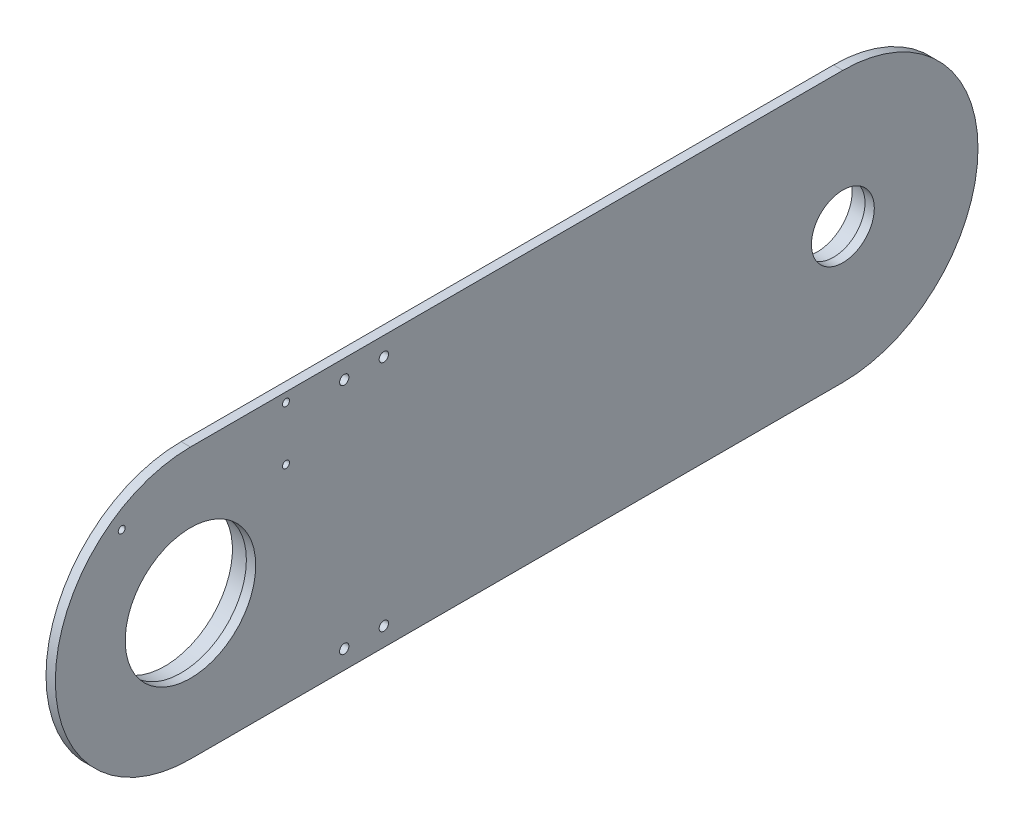
ISO-10303-21;
HEADER;
FILE_DESCRIPTION(('STEP AP214'),'2;1');
FILE_NAME('part.step','',(''),(''),'','','');
FILE_SCHEMA(('AUTOMOTIVE_DESIGN { 1 0 10303 214 1 1 1 1 }'));
ENDSEC;
DATA;
#1=APPLICATION_CONTEXT('core data for automotive mechanical design processes');
#2=APPLICATION_PROTOCOL_DEFINITION('international standard','automotive_design',2000,#1);
#3=PRODUCT_CONTEXT('',#1,'mechanical');
#4=PRODUCT('Part','Part','',(#3));
#5=PRODUCT_RELATED_PRODUCT_CATEGORY('part','',(#4));
#6=PRODUCT_DEFINITION_FORMATION('','',#4);
#7=PRODUCT_DEFINITION_CONTEXT('part definition',#1,'design');
#8=PRODUCT_DEFINITION('design','',#6,#7);
#9=PRODUCT_DEFINITION_SHAPE('','',#8);
#10=(LENGTH_UNIT() NAMED_UNIT(*) SI_UNIT(.MILLI.,.METRE.));
#11=(NAMED_UNIT(*) PLANE_ANGLE_UNIT() SI_UNIT($,.RADIAN.));
#12=(NAMED_UNIT(*) SI_UNIT($,.STERADIAN.) SOLID_ANGLE_UNIT());
#13=UNCERTAINTY_MEASURE_WITH_UNIT(LENGTH_MEASURE(1.E-05),#10,'distance_accuracy_value','');
#14=(GEOMETRIC_REPRESENTATION_CONTEXT(3) GLOBAL_UNCERTAINTY_ASSIGNED_CONTEXT((#13)) GLOBAL_UNIT_ASSIGNED_CONTEXT((#10,
#11,#12)) REPRESENTATION_CONTEXT('',''));
#15=CARTESIAN_POINT('',(0.,0.,0.));
#16=DIRECTION('',(0.,0.,1.));
#17=DIRECTION('',(1.,0.,0.));
#18=AXIS2_PLACEMENT_3D('',#15,#16,#17);
#19=CARTESIAN_POINT('',(4.,0.,0.));
#20=DIRECTION('',(1.,0.,0.));
#21=DIRECTION('',(0.,0.,-1.));
#22=AXIS2_PLACEMENT_3D('',#19,#20,#21);
#23=PLANE('',#22);
#24=CARTESIAN_POINT('',(4.,42.,29.5));
#25=DIRECTION('',(1.,0.,0.));
#26=DIRECTION('',(0.,0.,-1.));
#27=AXIS2_PLACEMENT_3D('',#24,#25,#26);
#28=CIRCLE('',#27,1.5);
#29=CARTESIAN_POINT('',(4.,42.,28.));
#30=VERTEX_POINT('',#29);
#31=EDGE_CURVE('E162',#30,#30,#28,.T.);
#32=ORIENTED_EDGE('',*,*,#31,.F.);
#33=EDGE_LOOP('',(#32));
#34=FACE_BOUND('',#33,.T.);
#35=CARTESIAN_POINT('',(4.,54.,-41.));
#36=DIRECTION('',(1.,0.,0.));
#37=DIRECTION('',(0.,0.,-1.));
#38=AXIS2_PLACEMENT_3D('',#35,#36,#37);
#39=CIRCLE('',#38,1.5);
#40=CARTESIAN_POINT('',(4.,54.,-42.5));
#41=VERTEX_POINT('',#40);
#42=EDGE_CURVE('E514',#41,#41,#39,.T.);
#43=ORIENTED_EDGE('',*,*,#42,.F.);
#44=EDGE_LOOP('',(#43));
#45=FACE_BOUND('',#44,.T.);
#46=CARTESIAN_POINT('',(4.,31.,-41.));
#47=DIRECTION('',(1.,0.,0.));
#48=DIRECTION('',(0.,0.,-1.));
#49=AXIS2_PLACEMENT_3D('',#46,#47,#48);
#50=CIRCLE('',#49,1.5);
#51=CARTESIAN_POINT('',(4.,31.,-42.5));
#52=VERTEX_POINT('',#51);
#53=EDGE_CURVE('E508',#52,#52,#50,.T.);
#54=ORIENTED_EDGE('',*,*,#53,.F.);
#55=EDGE_LOOP('',(#54));
#56=FACE_BOUND('',#55,.T.);
#57=CARTESIAN_POINT('',(4.,50.,-83.));
#58=DIRECTION('',(1.,0.,0.));
#59=DIRECTION('',(0.,0.,-1.));
#60=AXIS2_PLACEMENT_3D('',#57,#58,#59);
#61=CIRCLE('',#60,2.);
#62=CARTESIAN_POINT('',(4.,50.,-85.));
#63=VERTEX_POINT('',#62);
#64=EDGE_CURVE('E180',#63,#63,#61,.T.);
#65=ORIENTED_EDGE('',*,*,#64,.F.);
#66=EDGE_LOOP('',(#65));
#67=FACE_BOUND('',#66,.T.);
#68=CARTESIAN_POINT('',(4.,-50.,-83.));
#69=DIRECTION('',(-1.,0.,0.));
#70=DIRECTION('',(0.,0.,1.));
#71=AXIS2_PLACEMENT_3D('',#68,#69,#70);
#72=CIRCLE('',#71,2.);
#73=CARTESIAN_POINT('',(4.,-50.,-81.));
#74=VERTEX_POINT('',#73);
#75=EDGE_CURVE('E169',#74,#74,#72,.T.);
#76=ORIENTED_EDGE('',*,*,#75,.T.);
#77=EDGE_LOOP('',(#76));
#78=FACE_BOUND('',#77,.T.);
#79=CARTESIAN_POINT('',(4.,50.,-66.));
#80=DIRECTION('',(-1.,0.,0.));
#81=DIRECTION('',(0.,0.,1.));
#82=AXIS2_PLACEMENT_3D('',#79,#80,#81);
#83=CIRCLE('',#82,2.);
#84=CARTESIAN_POINT('',(4.,50.,-64.));
#85=VERTEX_POINT('',#84);
#86=EDGE_CURVE('E200',#85,#85,#83,.T.);
#87=ORIENTED_EDGE('',*,*,#86,.T.);
#88=EDGE_LOOP('',(#87));
#89=FACE_BOUND('',#88,.T.);
#90=CARTESIAN_POINT('',(4.,0.,0.));
#91=DIRECTION('',(1.,0.,0.));
#92=DIRECTION('',(0.,0.,-1.));
#93=AXIS2_PLACEMENT_3D('',#90,#91,#92);
#94=CIRCLE('',#93,28.);
#95=CARTESIAN_POINT('',(4.,0.,-28.));
#96=VERTEX_POINT('',#95);
#97=EDGE_CURVE('E126',#96,#96,#94,.T.);
#98=ORIENTED_EDGE('',*,*,#97,.F.);
#99=EDGE_LOOP('',(#98));
#100=FACE_BOUND('',#99,.T.);
#101=CARTESIAN_POINT('',(4.,0.,0.));
#102=DIRECTION('',(1.,0.,0.));
#103=DIRECTION('',(0.,0.,-1.));
#104=AXIS2_PLACEMENT_3D('',#101,#102,#103);
#105=CIRCLE('',#104,58.);
#106=CARTESIAN_POINT('',(4.,58.,0.));
#107=VERTEX_POINT('',#106);
#108=CARTESIAN_POINT('',(4.,-58.,0.));
#109=VERTEX_POINT('',#108);
#110=EDGE_CURVE('E103',#107,#109,#105,.T.);
#111=ORIENTED_EDGE('',*,*,#110,.T.);
#112=DIRECTION('',(0.,0.,-1.));
#113=VECTOR('',#112,1.);
#114=CARTESIAN_POINT('',(4.,-58.,0.));
#115=LINE('',#114,#113);
#116=CARTESIAN_POINT('',(4.,-58.,-280.));
#117=VERTEX_POINT('',#116);
#118=EDGE_CURVE('E98',#109,#117,#115,.T.);
#119=ORIENTED_EDGE('',*,*,#118,.T.);
#120=CARTESIAN_POINT('',(4.,0.,-280.));
#121=DIRECTION('',(1.,0.,0.));
#122=DIRECTION('',(0.,0.,-1.));
#123=AXIS2_PLACEMENT_3D('',#120,#121,#122);
#124=CIRCLE('',#123,58.);
#125=CARTESIAN_POINT('',(4.,58.,-280.));
#126=VERTEX_POINT('',#125);
#127=EDGE_CURVE('E101',#117,#126,#124,.T.);
#128=ORIENTED_EDGE('',*,*,#127,.T.);
#129=DIRECTION('',(0.,0.,1.));
#130=VECTOR('',#129,1.);
#131=CARTESIAN_POINT('',(4.,58.,0.));
#132=LINE('',#131,#130);
#133=EDGE_CURVE('E67',#126,#107,#132,.T.);
#134=ORIENTED_EDGE('',*,*,#133,.T.);
#135=EDGE_LOOP('',(#111,#119,#128,#134));
#136=FACE_BOUND('',#135,.T.);
#137=CARTESIAN_POINT('',(4.,0.,-280.));
#138=DIRECTION('',(1.,0.,0.));
#139=DIRECTION('',(0.,0.,-1.));
#140=AXIS2_PLACEMENT_3D('',#137,#138,#139);
#141=CIRCLE('',#140,13.5);
#142=CARTESIAN_POINT('',(4.,0.,-293.5));
#143=VERTEX_POINT('',#142);
#144=EDGE_CURVE('E216',#143,#143,#141,.T.);
#145=ORIENTED_EDGE('',*,*,#144,.F.);
#146=EDGE_LOOP('',(#145));
#147=FACE_BOUND('',#146,.T.);
#148=CARTESIAN_POINT('',(4.,-50.,-66.));
#149=DIRECTION('',(1.,0.,0.));
#150=DIRECTION('',(0.,0.,-1.));
#151=AXIS2_PLACEMENT_3D('',#148,#149,#150);
#152=CIRCLE('',#151,2.);
#153=CARTESIAN_POINT('',(4.,-50.,-68.));
#154=VERTEX_POINT('',#153);
#155=EDGE_CURVE('E189',#154,#154,#152,.T.);
#156=ORIENTED_EDGE('',*,*,#155,.F.);
#157=EDGE_LOOP('',(#156));
#158=FACE_BOUND('',#157,.T.);
#159=ADVANCED_FACE('F46',(#34,#45,#56,#67,#78,#89,#100,#136,#147,#158),#23,.T.);
#160=CARTESIAN_POINT('',(0.,0.,0.));
#161=DIRECTION('',(1.,0.,0.));
#162=DIRECTION('',(0.,0.,-1.));
#163=AXIS2_PLACEMENT_3D('',#160,#161,#162);
#164=PLANE('',#163);
#165=CARTESIAN_POINT('',(0.,42.,29.5));
#166=DIRECTION('',(1.,0.,0.));
#167=DIRECTION('',(0.,0.,-1.));
#168=AXIS2_PLACEMENT_3D('',#165,#166,#167);
#169=CIRCLE('',#168,1.5);
#170=CARTESIAN_POINT('',(0.,42.,28.));
#171=VERTEX_POINT('',#170);
#172=EDGE_CURVE('E51',#171,#171,#169,.T.);
#173=ORIENTED_EDGE('',*,*,#172,.T.);
#174=EDGE_LOOP('',(#173));
#175=FACE_BOUND('',#174,.T.);
#176=CARTESIAN_POINT('',(0.,54.,-41.));
#177=DIRECTION('',(1.,0.,0.));
#178=DIRECTION('',(0.,0.,-1.));
#179=AXIS2_PLACEMENT_3D('',#176,#177,#178);
#180=CIRCLE('',#179,1.5);
#181=CARTESIAN_POINT('',(0.,54.,-42.5));
#182=VERTEX_POINT('',#181);
#183=EDGE_CURVE('E161',#182,#182,#180,.T.);
#184=ORIENTED_EDGE('',*,*,#183,.T.);
#185=EDGE_LOOP('',(#184));
#186=FACE_BOUND('',#185,.T.);
#187=CARTESIAN_POINT('',(0.,31.,-41.));
#188=DIRECTION('',(1.,0.,0.));
#189=DIRECTION('',(0.,0.,-1.));
#190=AXIS2_PLACEMENT_3D('',#187,#188,#189);
#191=CIRCLE('',#190,1.5);
#192=CARTESIAN_POINT('',(0.,31.,-42.5));
#193=VERTEX_POINT('',#192);
#194=EDGE_CURVE('E158',#193,#193,#191,.T.);
#195=ORIENTED_EDGE('',*,*,#194,.T.);
#196=EDGE_LOOP('',(#195));
#197=FACE_BOUND('',#196,.T.);
#198=CARTESIAN_POINT('',(0.,-50.,-83.));
#199=DIRECTION('',(-1.,0.,0.));
#200=DIRECTION('',(0.,0.,1.));
#201=AXIS2_PLACEMENT_3D('',#198,#199,#200);
#202=CIRCLE('',#201,2.);
#203=CARTESIAN_POINT('',(0.,-50.,-81.));
#204=VERTEX_POINT('',#203);
#205=EDGE_CURVE('E174',#204,#204,#202,.T.);
#206=ORIENTED_EDGE('',*,*,#205,.F.);
#207=EDGE_LOOP('',(#206));
#208=FACE_BOUND('',#207,.T.);
#209=CARTESIAN_POINT('',(0.,50.,-66.));
#210=DIRECTION('',(-1.,0.,0.));
#211=DIRECTION('',(0.,0.,1.));
#212=AXIS2_PLACEMENT_3D('',#209,#210,#211);
#213=CIRCLE('',#212,2.);
#214=CARTESIAN_POINT('',(0.,50.,-64.));
#215=VERTEX_POINT('',#214);
#216=EDGE_CURVE('E188',#215,#215,#213,.T.);
#217=ORIENTED_EDGE('',*,*,#216,.F.);
#218=EDGE_LOOP('',(#217));
#219=FACE_BOUND('',#218,.T.);
#220=CARTESIAN_POINT('',(0.,0.,-280.));
#221=DIRECTION('',(1.,0.,0.));
#222=DIRECTION('',(0.,0.,-1.));
#223=AXIS2_PLACEMENT_3D('',#220,#221,#222);
#224=CIRCLE('',#223,28.0000000000001);
#225=CARTESIAN_POINT('',(0.,0.,-308.));
#226=VERTEX_POINT('',#225);
#227=EDGE_CURVE('E151',#226,#226,#224,.T.);
#228=ORIENTED_EDGE('',*,*,#227,.T.);
#229=EDGE_LOOP('',(#228));
#230=FACE_BOUND('',#229,.T.);
#231=CARTESIAN_POINT('',(0.,0.,0.));
#232=DIRECTION('',(1.,0.,0.));
#233=DIRECTION('',(0.,0.,-1.));
#234=AXIS2_PLACEMENT_3D('',#231,#232,#233);
#235=CIRCLE('',#234,42.0000000000001);
#236=CARTESIAN_POINT('',(0.,0.,-42.0000000000001));
#237=VERTEX_POINT('',#236);
#238=EDGE_CURVE('E147',#237,#237,#235,.T.);
#239=ORIENTED_EDGE('',*,*,#238,.T.);
#240=EDGE_LOOP('',(#239));
#241=FACE_BOUND('',#240,.T.);
#242=CARTESIAN_POINT('',(0.,0.,0.));
#243=DIRECTION('',(1.,0.,0.));
#244=DIRECTION('',(0.,0.,-1.));
#245=AXIS2_PLACEMENT_3D('',#242,#243,#244);
#246=CIRCLE('',#245,58.);
#247=CARTESIAN_POINT('',(0.,58.,0.));
#248=VERTEX_POINT('',#247);
#249=CARTESIAN_POINT('',(0.,-58.,0.));
#250=VERTEX_POINT('',#249);
#251=EDGE_CURVE('E122',#248,#250,#246,.T.);
#252=ORIENTED_EDGE('',*,*,#251,.F.);
#253=DIRECTION('',(0.,0.,1.));
#254=VECTOR('',#253,1.);
#255=CARTESIAN_POINT('',(0.,58.,0.));
#256=LINE('',#255,#254);
#257=CARTESIAN_POINT('',(0.,58.,-280.));
#258=VERTEX_POINT('',#257);
#259=EDGE_CURVE('E90',#258,#248,#256,.T.);
#260=ORIENTED_EDGE('',*,*,#259,.F.);
#261=CARTESIAN_POINT('',(0.,0.,-280.));
#262=DIRECTION('',(1.,0.,0.));
#263=DIRECTION('',(0.,0.,-1.));
#264=AXIS2_PLACEMENT_3D('',#261,#262,#263);
#265=CIRCLE('',#264,58.);
#266=CARTESIAN_POINT('',(0.,-58.,-280.));
#267=VERTEX_POINT('',#266);
#268=EDGE_CURVE('E84',#267,#258,#265,.T.);
#269=ORIENTED_EDGE('',*,*,#268,.F.);
#270=DIRECTION('',(0.,0.,-1.));
#271=VECTOR('',#270,1.);
#272=CARTESIAN_POINT('',(0.,-58.,0.));
#273=LINE('',#272,#271);
#274=EDGE_CURVE('E109',#250,#267,#273,.T.);
#275=ORIENTED_EDGE('',*,*,#274,.F.);
#276=EDGE_LOOP('',(#252,#260,#269,#275));
#277=FACE_BOUND('',#276,.T.);
#278=CARTESIAN_POINT('',(0.,50.,-83.));
#279=DIRECTION('',(1.,0.,0.));
#280=DIRECTION('',(0.,0.,-1.));
#281=AXIS2_PLACEMENT_3D('',#278,#279,#280);
#282=CIRCLE('',#281,2.);
#283=CARTESIAN_POINT('',(0.,50.,-85.));
#284=VERTEX_POINT('',#283);
#285=EDGE_CURVE('E193',#284,#284,#282,.T.);
#286=ORIENTED_EDGE('',*,*,#285,.T.);
#287=EDGE_LOOP('',(#286));
#288=FACE_BOUND('',#287,.T.);
#289=CARTESIAN_POINT('',(0.,-50.,-66.));
#290=DIRECTION('',(1.,0.,0.));
#291=DIRECTION('',(0.,0.,-1.));
#292=AXIS2_PLACEMENT_3D('',#289,#290,#291);
#293=CIRCLE('',#292,2.);
#294=CARTESIAN_POINT('',(0.,-50.,-68.));
#295=VERTEX_POINT('',#294);
#296=EDGE_CURVE('E184',#295,#295,#293,.T.);
#297=ORIENTED_EDGE('',*,*,#296,.T.);
#298=EDGE_LOOP('',(#297));
#299=FACE_BOUND('',#298,.T.);
#300=ADVANCED_FACE('F251',(#175,#186,#197,#208,#219,#230,#241,#277,#288,#299),#164,.F.);
#301=CARTESIAN_POINT('',(0.,0.,-280.));
#302=DIRECTION('',(1.,0.,0.));
#303=DIRECTION('',(0.,0.,-1.));
#304=AXIS2_PLACEMENT_3D('',#301,#302,#303);
#305=CIRCLE('',#304,13.5);
#306=CARTESIAN_POINT('',(0.,0.,-293.5));
#307=VERTEX_POINT('',#306);
#308=EDGE_CURVE('E215',#307,#307,#305,.T.);
#309=ORIENTED_EDGE('',*,*,#308,.T.);
#310=EDGE_LOOP('',(#309));
#311=FACE_BOUND('',#310,.T.);
#312=CARTESIAN_POINT('',(0.,0.,-280.));
#313=DIRECTION('',(1.,0.,0.));
#314=DIRECTION('',(0.,0.,-1.));
#315=AXIS2_PLACEMENT_3D('',#312,#313,#314);
#316=CIRCLE('',#315,15.);
#317=CARTESIAN_POINT('',(0.,0.,-295.));
#318=VERTEX_POINT('',#317);
#319=EDGE_CURVE('E143',#318,#318,#316,.T.);
#320=ORIENTED_EDGE('',*,*,#319,.F.);
#321=EDGE_LOOP('',(#320));
#322=FACE_BOUND('',#321,.T.);
#323=ADVANCED_FACE('F257',(#311,#322),#164,.F.);
#324=CARTESIAN_POINT('',(0.,0.,0.));
#325=DIRECTION('',(1.,0.,0.));
#326=DIRECTION('',(0.,0.,-1.));
#327=AXIS2_PLACEMENT_3D('',#324,#325,#326);
#328=CIRCLE('',#327,28.);
#329=CARTESIAN_POINT('',(0.,0.,-28.));
#330=VERTEX_POINT('',#329);
#331=EDGE_CURVE('E220',#330,#330,#328,.T.);
#332=ORIENTED_EDGE('',*,*,#331,.T.);
#333=EDGE_LOOP('',(#332));
#334=FACE_BOUND('',#333,.T.);
#335=CARTESIAN_POINT('',(0.,0.,0.));
#336=DIRECTION('',(1.,0.,0.));
#337=DIRECTION('',(0.,0.,-1.));
#338=AXIS2_PLACEMENT_3D('',#335,#336,#337);
#339=CIRCLE('',#338,29.);
#340=CARTESIAN_POINT('',(0.,0.,-29.));
#341=VERTEX_POINT('',#340);
#342=EDGE_CURVE('E139',#341,#341,#339,.T.);
#343=ORIENTED_EDGE('',*,*,#342,.F.);
#344=EDGE_LOOP('',(#343));
#345=FACE_BOUND('',#344,.T.);
#346=ADVANCED_FACE('F232',(#334,#345),#164,.F.);
#347=CARTESIAN_POINT('',(4.,0.,0.));
#348=DIRECTION('',(-1.,0.,0.));
#349=DIRECTION('',(0.,0.,1.));
#350=AXIS2_PLACEMENT_3D('',#347,#348,#349);
#351=CYLINDRICAL_SURFACE('',#350,58.);
#352=ORIENTED_EDGE('',*,*,#251,.T.);
#353=DIRECTION('',(-1.,0.,0.));
#354=VECTOR('',#353,1.);
#355=CARTESIAN_POINT('',(4.,-58.,0.));
#356=LINE('',#355,#354);
#357=EDGE_CURVE('E111',#109,#250,#356,.T.);
#358=ORIENTED_EDGE('',*,*,#357,.F.);
#359=ORIENTED_EDGE('',*,*,#110,.F.);
#360=DIRECTION('',(-1.,0.,0.));
#361=VECTOR('',#360,1.);
#362=CARTESIAN_POINT('',(4.,58.,0.));
#363=LINE('',#362,#361);
#364=EDGE_CURVE('E118',#107,#248,#363,.T.);
#365=ORIENTED_EDGE('',*,*,#364,.T.);
#366=EDGE_LOOP('',(#352,#358,#359,#365));
#367=FACE_BOUND('',#366,.T.);
#368=ADVANCED_FACE('F266',(#367),#351,.T.);
#369=CARTESIAN_POINT('',(4.,-58.,0.));
#370=DIRECTION('',(0.,1.,0.));
#371=DIRECTION('',(0.,0.,1.));
#372=AXIS2_PLACEMENT_3D('',#369,#370,#371);
#373=PLANE('',#372);
#374=ORIENTED_EDGE('',*,*,#274,.T.);
#375=DIRECTION('',(-1.,0.,0.));
#376=VECTOR('',#375,1.);
#377=CARTESIAN_POINT('',(4.,-58.,-280.));
#378=LINE('',#377,#376);
#379=EDGE_CURVE('E107',#117,#267,#378,.T.);
#380=ORIENTED_EDGE('',*,*,#379,.F.);
#381=ORIENTED_EDGE('',*,*,#118,.F.);
#382=ORIENTED_EDGE('',*,*,#357,.T.);
#383=EDGE_LOOP('',(#374,#380,#381,#382));
#384=FACE_BOUND('',#383,.T.);
#385=ADVANCED_FACE('F108',(#384),#373,.F.);
#386=CARTESIAN_POINT('',(4.,0.,-280.));
#387=DIRECTION('',(-1.,0.,0.));
#388=DIRECTION('',(0.,0.,1.));
#389=AXIS2_PLACEMENT_3D('',#386,#387,#388);
#390=CYLINDRICAL_SURFACE('',#389,58.);
#391=ORIENTED_EDGE('',*,*,#268,.T.);
#392=DIRECTION('',(-1.,0.,0.));
#393=VECTOR('',#392,1.);
#394=CARTESIAN_POINT('',(4.,58.,-280.));
#395=LINE('',#394,#393);
#396=EDGE_CURVE('E112',#126,#258,#395,.T.);
#397=ORIENTED_EDGE('',*,*,#396,.F.);
#398=ORIENTED_EDGE('',*,*,#127,.F.);
#399=ORIENTED_EDGE('',*,*,#379,.T.);
#400=EDGE_LOOP('',(#391,#397,#398,#399));
#401=FACE_BOUND('',#400,.T.);
#402=ADVANCED_FACE('F114',(#401),#390,.T.);
#403=CARTESIAN_POINT('',(4.,58.,0.));
#404=DIRECTION('',(0.,-1.,0.));
#405=DIRECTION('',(0.,0.,-1.));
#406=AXIS2_PLACEMENT_3D('',#403,#404,#405);
#407=PLANE('',#406);
#408=ORIENTED_EDGE('',*,*,#259,.T.);
#409=ORIENTED_EDGE('',*,*,#364,.F.);
#410=ORIENTED_EDGE('',*,*,#133,.F.);
#411=ORIENTED_EDGE('',*,*,#396,.T.);
#412=EDGE_LOOP('',(#408,#409,#410,#411));
#413=FACE_BOUND('',#412,.T.);
#414=ADVANCED_FACE('F238',(#413),#407,.F.);
#415=CARTESIAN_POINT('',(4.,0.,0.));
#416=DIRECTION('',(-1.,0.,0.));
#417=DIRECTION('',(0.,0.,1.));
#418=AXIS2_PLACEMENT_3D('',#415,#416,#417);
#419=CYLINDRICAL_SURFACE('',#418,28.);
#420=ORIENTED_EDGE('',*,*,#97,.T.);
#421=EDGE_LOOP('',(#420));
#422=FACE_BOUND('',#421,.T.);
#423=ORIENTED_EDGE('',*,*,#331,.F.);
#424=EDGE_LOOP('',(#423));
#425=FACE_BOUND('',#424,.T.);
#426=ADVANCED_FACE('F235',(#422,#425),#419,.F.);
#427=CARTESIAN_POINT('',(4.,0.,-280.));
#428=DIRECTION('',(-1.,0.,0.));
#429=DIRECTION('',(0.,0.,1.));
#430=AXIS2_PLACEMENT_3D('',#427,#428,#429);
#431=CYLINDRICAL_SURFACE('',#430,13.5);
#432=ORIENTED_EDGE('',*,*,#144,.T.);
#433=EDGE_LOOP('',(#432));
#434=FACE_BOUND('',#433,.T.);
#435=ORIENTED_EDGE('',*,*,#308,.F.);
#436=EDGE_LOOP('',(#435));
#437=FACE_BOUND('',#436,.T.);
#438=ADVANCED_FACE('F237',(#434,#437),#431,.F.);
#439=CARTESIAN_POINT('',(96.1665222413705,0.,0.));
#440=DIRECTION('',(-1.,0.,0.));
#441=DIRECTION('',(0.,0.,1.));
#442=AXIS2_PLACEMENT_3D('',#439,#440,#441);
#443=CYLINDRICAL_SURFACE('',#442,29.);
#444=CARTESIAN_POINT('',(-7.,0.,0.));
#445=DIRECTION('',(-1.,0.,0.));
#446=DIRECTION('',(0.,0.,1.));
#447=AXIS2_PLACEMENT_3D('',#444,#445,#446);
#448=CIRCLE('',#447,29.);
#449=CARTESIAN_POINT('',(-7.,0.,29.));
#450=VERTEX_POINT('',#449);
#451=EDGE_CURVE('E211',#450,#450,#448,.T.);
#452=ORIENTED_EDGE('',*,*,#451,.T.);
#453=EDGE_LOOP('',(#452));
#454=FACE_BOUND('',#453,.T.);
#455=ORIENTED_EDGE('',*,*,#342,.T.);
#456=EDGE_LOOP('',(#455));
#457=FACE_BOUND('',#456,.T.);
#458=ADVANCED_FACE('F245',(#454,#457),#443,.F.);
#459=CARTESIAN_POINT('',(-7.,0.,0.));
#460=DIRECTION('',(-1.,0.,0.));
#461=DIRECTION('',(0.,0.,1.));
#462=AXIS2_PLACEMENT_3D('',#459,#460,#461);
#463=PLANE('',#462);
#464=CARTESIAN_POINT('',(-7.,0.,0.));
#465=DIRECTION('',(-1.,0.,0.));
#466=DIRECTION('',(0.,0.,1.));
#467=AXIS2_PLACEMENT_3D('',#464,#465,#466);
#468=CIRCLE('',#467,35.0000000000001);
#469=CARTESIAN_POINT('',(-7.,0.,35.0000000000001));
#470=VERTEX_POINT('',#469);
#471=EDGE_CURVE('E11',#470,#470,#468,.T.);
#472=ORIENTED_EDGE('',*,*,#471,.T.);
#473=EDGE_LOOP('',(#472));
#474=FACE_BOUND('',#473,.T.);
#475=ORIENTED_EDGE('',*,*,#451,.F.);
#476=EDGE_LOOP('',(#475));
#477=FACE_BOUND('',#476,.T.);
#478=ADVANCED_FACE('F295',(#474,#477),#463,.T.);
#479=CARTESIAN_POINT('',(96.1665222413705,0.,-280.));
#480=DIRECTION('',(-1.,0.,0.));
#481=DIRECTION('',(0.,0.,1.));
#482=AXIS2_PLACEMENT_3D('',#479,#480,#481);
#483=CYLINDRICAL_SURFACE('',#482,15.);
#484=CARTESIAN_POINT('',(-7.,0.,-280.));
#485=DIRECTION('',(-1.,0.,0.));
#486=DIRECTION('',(0.,0.,1.));
#487=AXIS2_PLACEMENT_3D('',#484,#485,#486);
#488=CIRCLE('',#487,15.);
#489=CARTESIAN_POINT('',(-7.,0.,-265.));
#490=VERTEX_POINT('',#489);
#491=EDGE_CURVE('E204',#490,#490,#488,.T.);
#492=ORIENTED_EDGE('',*,*,#491,.T.);
#493=EDGE_LOOP('',(#492));
#494=FACE_BOUND('',#493,.T.);
#495=ORIENTED_EDGE('',*,*,#319,.T.);
#496=EDGE_LOOP('',(#495));
#497=FACE_BOUND('',#496,.T.);
#498=ADVANCED_FACE('F283',(#494,#497),#483,.F.);
#499=CARTESIAN_POINT('',(-7.,0.,-280.));
#500=DIRECTION('',(-1.,0.,0.));
#501=DIRECTION('',(0.,0.,1.));
#502=AXIS2_PLACEMENT_3D('',#499,#500,#501);
#503=PLANE('',#502);
#504=CARTESIAN_POINT('',(-7.,17.,-280.));
#505=DIRECTION('',(-1.,0.,0.));
#506=DIRECTION('',(0.,0.,1.));
#507=AXIS2_PLACEMENT_3D('',#504,#505,#506);
#508=CIRCLE('',#507,1.50000000000002);
#509=CARTESIAN_POINT('',(-7.,17.,-278.5));
#510=VERTEX_POINT('',#509);
#511=EDGE_CURVE('E509',#510,#510,#508,.T.);
#512=ORIENTED_EDGE('',*,*,#511,.F.);
#513=EDGE_LOOP('',(#512));
#514=FACE_BOUND('',#513,.T.);
#515=CARTESIAN_POINT('',(-7.,0.,-263.));
#516=DIRECTION('',(-1.,0.,0.));
#517=DIRECTION('',(0.,0.,1.));
#518=AXIS2_PLACEMENT_3D('',#515,#516,#517);
#519=CIRCLE('',#518,1.50000000000002);
#520=CARTESIAN_POINT('',(-7.,0.,-261.5));
#521=VERTEX_POINT('',#520);
#522=EDGE_CURVE('E516',#521,#521,#519,.T.);
#523=ORIENTED_EDGE('',*,*,#522,.F.);
#524=EDGE_LOOP('',(#523));
#525=FACE_BOUND('',#524,.T.);
#526=CARTESIAN_POINT('',(-7.,-17.,-280.));
#527=DIRECTION('',(-1.,0.,0.));
#528=DIRECTION('',(0.,0.,1.));
#529=AXIS2_PLACEMENT_3D('',#526,#527,#528);
#530=CIRCLE('',#529,1.50000000000002);
#531=CARTESIAN_POINT('',(-7.,-17.,-278.5));
#532=VERTEX_POINT('',#531);
#533=EDGE_CURVE('E526',#532,#532,#530,.T.);
#534=ORIENTED_EDGE('',*,*,#533,.F.);
#535=EDGE_LOOP('',(#534));
#536=FACE_BOUND('',#535,.T.);
#537=CARTESIAN_POINT('',(-7.,0.,-297.));
#538=DIRECTION('',(-1.,0.,0.));
#539=DIRECTION('',(0.,0.,1.));
#540=AXIS2_PLACEMENT_3D('',#537,#538,#539);
#541=CIRCLE('',#540,1.50000000000002);
#542=CARTESIAN_POINT('',(-7.,0.,-295.5));
#543=VERTEX_POINT('',#542);
#544=EDGE_CURVE('E534',#543,#543,#541,.T.);
#545=ORIENTED_EDGE('',*,*,#544,.F.);
#546=EDGE_LOOP('',(#545));
#547=FACE_BOUND('',#546,.T.);
#548=CARTESIAN_POINT('',(-7.,0.,-280.));
#549=DIRECTION('',(-1.,0.,0.));
#550=DIRECTION('',(0.,0.,1.));
#551=AXIS2_PLACEMENT_3D('',#548,#549,#550);
#552=CIRCLE('',#551,21.0000000000002);
#553=CARTESIAN_POINT('',(-7.,0.,-259.));
#554=VERTEX_POINT('',#553);
#555=EDGE_CURVE('E58',#554,#554,#552,.T.);
#556=ORIENTED_EDGE('',*,*,#555,.T.);
#557=EDGE_LOOP('',(#556));
#558=FACE_BOUND('',#557,.T.);
#559=ORIENTED_EDGE('',*,*,#491,.F.);
#560=EDGE_LOOP('',(#559));
#561=FACE_BOUND('',#560,.T.);
#562=ADVANCED_FACE('F274',(#514,#525,#536,#547,#558,#561),#503,.T.);
#563=CARTESIAN_POINT('',(-8.00000000000015,0.,-280.));
#564=DIRECTION('',(1.,0.,0.));
#565=DIRECTION('',(0.,0.,-1.));
#566=AXIS2_PLACEMENT_3D('',#563,#564,#565);
#567=CONICAL_SURFACE('',#566,20.,0.785398163397443);
#568=ORIENTED_EDGE('',*,*,#227,.F.);
#569=EDGE_LOOP('',(#568));
#570=FACE_BOUND('',#569,.T.);
#571=ORIENTED_EDGE('',*,*,#555,.F.);
#572=EDGE_LOOP('',(#571));
#573=FACE_BOUND('',#572,.T.);
#574=ADVANCED_FACE('F270',(#570,#573),#567,.T.);
#575=CARTESIAN_POINT('',(-8.00000000000015,0.,0.));
#576=DIRECTION('',(1.,0.,0.));
#577=DIRECTION('',(0.,0.,-1.));
#578=AXIS2_PLACEMENT_3D('',#575,#576,#577);
#579=CONICAL_SURFACE('',#578,34.,0.785398163397443);
#580=ORIENTED_EDGE('',*,*,#238,.F.);
#581=EDGE_LOOP('',(#580));
#582=FACE_BOUND('',#581,.T.);
#583=ORIENTED_EDGE('',*,*,#471,.F.);
#584=EDGE_LOOP('',(#583));
#585=FACE_BOUND('',#584,.T.);
#586=ADVANCED_FACE('F49',(#582,#585),#579,.T.);
#587=CARTESIAN_POINT('',(4.,50.,-66.));
#588=DIRECTION('',(-1.,0.,0.));
#589=DIRECTION('',(0.,0.,1.));
#590=AXIS2_PLACEMENT_3D('',#587,#588,#589);
#591=CYLINDRICAL_SURFACE('',#590,2.);
#592=ORIENTED_EDGE('',*,*,#86,.F.);
#593=EDGE_LOOP('',(#592));
#594=FACE_BOUND('',#593,.T.);
#595=ORIENTED_EDGE('',*,*,#216,.T.);
#596=EDGE_LOOP('',(#595));
#597=FACE_BOUND('',#596,.T.);
#598=ADVANCED_FACE('F280',(#594,#597),#591,.F.);
#599=CARTESIAN_POINT('',(4.,-50.,-83.));
#600=DIRECTION('',(-1.,0.,0.));
#601=DIRECTION('',(0.,0.,1.));
#602=AXIS2_PLACEMENT_3D('',#599,#600,#601);
#603=CYLINDRICAL_SURFACE('',#602,2.);
#604=ORIENTED_EDGE('',*,*,#75,.F.);
#605=EDGE_LOOP('',(#604));
#606=FACE_BOUND('',#605,.T.);
#607=ORIENTED_EDGE('',*,*,#205,.T.);
#608=EDGE_LOOP('',(#607));
#609=FACE_BOUND('',#608,.T.);
#610=ADVANCED_FACE('F363',(#606,#609),#603,.F.);
#611=CARTESIAN_POINT('',(4.,50.,-83.));
#612=DIRECTION('',(-1.,0.,0.));
#613=DIRECTION('',(0.,0.,1.));
#614=AXIS2_PLACEMENT_3D('',#611,#612,#613);
#615=CYLINDRICAL_SURFACE('',#614,2.);
#616=ORIENTED_EDGE('',*,*,#64,.T.);
#617=EDGE_LOOP('',(#616));
#618=FACE_BOUND('',#617,.T.);
#619=ORIENTED_EDGE('',*,*,#285,.F.);
#620=EDGE_LOOP('',(#619));
#621=FACE_BOUND('',#620,.T.);
#622=ADVANCED_FACE('F372',(#618,#621),#615,.F.);
#623=CARTESIAN_POINT('',(4.,-50.,-66.));
#624=DIRECTION('',(-1.,0.,0.));
#625=DIRECTION('',(0.,0.,1.));
#626=AXIS2_PLACEMENT_3D('',#623,#624,#625);
#627=CYLINDRICAL_SURFACE('',#626,2.);
#628=ORIENTED_EDGE('',*,*,#155,.T.);
#629=EDGE_LOOP('',(#628));
#630=FACE_BOUND('',#629,.T.);
#631=ORIENTED_EDGE('',*,*,#296,.F.);
#632=EDGE_LOOP('',(#631));
#633=FACE_BOUND('',#632,.T.);
#634=ADVANCED_FACE('F381',(#630,#633),#627,.F.);
#635=CARTESIAN_POINT('',(-7.,31.,-41.));
#636=DIRECTION('',(1.,0.,0.));
#637=DIRECTION('',(0.,0.,-1.));
#638=AXIS2_PLACEMENT_3D('',#635,#636,#637);
#639=CYLINDRICAL_SURFACE('',#638,1.5);
#640=ORIENTED_EDGE('',*,*,#53,.T.);
#641=EDGE_LOOP('',(#640));
#642=FACE_BOUND('',#641,.T.);
#643=ORIENTED_EDGE('',*,*,#194,.F.);
#644=EDGE_LOOP('',(#643));
#645=FACE_BOUND('',#644,.T.);
#646=ADVANCED_FACE('F389',(#642,#645),#639,.F.);
#647=CARTESIAN_POINT('',(-7.,54.,-41.));
#648=DIRECTION('',(1.,0.,0.));
#649=DIRECTION('',(0.,0.,-1.));
#650=AXIS2_PLACEMENT_3D('',#647,#648,#649);
#651=CYLINDRICAL_SURFACE('',#650,1.5);
#652=ORIENTED_EDGE('',*,*,#42,.T.);
#653=EDGE_LOOP('',(#652));
#654=FACE_BOUND('',#653,.T.);
#655=ORIENTED_EDGE('',*,*,#183,.F.);
#656=EDGE_LOOP('',(#655));
#657=FACE_BOUND('',#656,.T.);
#658=ADVANCED_FACE('F398',(#654,#657),#651,.F.);
#659=CARTESIAN_POINT('',(-7.,42.,29.5));
#660=DIRECTION('',(1.,0.,0.));
#661=DIRECTION('',(0.,0.,-1.));
#662=AXIS2_PLACEMENT_3D('',#659,#660,#661);
#663=CYLINDRICAL_SURFACE('',#662,1.5);
#664=ORIENTED_EDGE('',*,*,#31,.T.);
#665=EDGE_LOOP('',(#664));
#666=FACE_BOUND('',#665,.T.);
#667=ORIENTED_EDGE('',*,*,#172,.F.);
#668=EDGE_LOOP('',(#667));
#669=FACE_BOUND('',#668,.T.);
#670=ADVANCED_FACE('F407',(#666,#669),#663,.F.);
#671=CARTESIAN_POINT('',(-2.,0.,-297.));
#672=DIRECTION('',(-1.,0.,0.));
#673=DIRECTION('',(0.,0.,1.));
#674=AXIS2_PLACEMENT_3D('',#671,#672,#673);
#675=CYLINDRICAL_SURFACE('',#674,1.50000000000002);
#676=CARTESIAN_POINT('',(-2.,0.,-297.));
#677=DIRECTION('',(-1.,0.,0.));
#678=DIRECTION('',(0.,0.,1.));
#679=AXIS2_PLACEMENT_3D('',#676,#677,#678);
#680=CIRCLE('',#679,1.50000000000002);
#681=CARTESIAN_POINT('',(-2.,0.,-295.5));
#682=VERTEX_POINT('',#681);
#683=EDGE_CURVE('E538',#682,#682,#680,.T.);
#684=ORIENTED_EDGE('',*,*,#683,.F.);
#685=EDGE_LOOP('',(#684));
#686=FACE_BOUND('',#685,.T.);
#687=ORIENTED_EDGE('',*,*,#544,.T.);
#688=EDGE_LOOP('',(#687));
#689=FACE_BOUND('',#688,.T.);
#690=ADVANCED_FACE('F416',(#686,#689),#675,.F.);
#691=CARTESIAN_POINT('',(-2.,0.,-297.));
#692=DIRECTION('',(-1.,0.,0.));
#693=DIRECTION('',(0.,0.,1.));
#694=AXIS2_PLACEMENT_3D('',#691,#692,#693);
#695=PLANE('',#694);
#696=ORIENTED_EDGE('',*,*,#683,.T.);
#697=EDGE_LOOP('',(#696));
#698=FACE_BOUND('',#697,.T.);
#699=ADVANCED_FACE('F425',(#698),#695,.T.);
#700=CARTESIAN_POINT('',(-2.,-17.,-280.));
#701=DIRECTION('',(-1.,0.,0.));
#702=DIRECTION('',(0.,0.,1.));
#703=AXIS2_PLACEMENT_3D('',#700,#701,#702);
#704=CYLINDRICAL_SURFACE('',#703,1.50000000000002);
#705=CARTESIAN_POINT('',(-2.,-17.,-280.));
#706=DIRECTION('',(-1.,0.,0.));
#707=DIRECTION('',(0.,0.,1.));
#708=AXIS2_PLACEMENT_3D('',#705,#706,#707);
#709=CIRCLE('',#708,1.50000000000002);
#710=CARTESIAN_POINT('',(-2.,-17.,-278.5));
#711=VERTEX_POINT('',#710);
#712=EDGE_CURVE('E530',#711,#711,#709,.T.);
#713=ORIENTED_EDGE('',*,*,#712,.F.);
#714=EDGE_LOOP('',(#713));
#715=FACE_BOUND('',#714,.T.);
#716=ORIENTED_EDGE('',*,*,#533,.T.);
#717=EDGE_LOOP('',(#716));
#718=FACE_BOUND('',#717,.T.);
#719=ADVANCED_FACE('F434',(#715,#718),#704,.F.);
#720=CARTESIAN_POINT('',(-2.,-17.,-280.));
#721=DIRECTION('',(-1.,0.,0.));
#722=DIRECTION('',(0.,0.,1.));
#723=AXIS2_PLACEMENT_3D('',#720,#721,#722);
#724=PLANE('',#723);
#725=ORIENTED_EDGE('',*,*,#712,.T.);
#726=EDGE_LOOP('',(#725));
#727=FACE_BOUND('',#726,.T.);
#728=ADVANCED_FACE('F443',(#727),#724,.T.);
#729=CARTESIAN_POINT('',(-2.,0.,-263.));
#730=DIRECTION('',(-1.,0.,0.));
#731=DIRECTION('',(0.,0.,1.));
#732=AXIS2_PLACEMENT_3D('',#729,#730,#731);
#733=CYLINDRICAL_SURFACE('',#732,1.50000000000002);
#734=CARTESIAN_POINT('',(-2.,0.,-263.));
#735=DIRECTION('',(-1.,0.,0.));
#736=DIRECTION('',(0.,0.,1.));
#737=AXIS2_PLACEMENT_3D('',#734,#735,#736);
#738=CIRCLE('',#737,1.50000000000002);
#739=CARTESIAN_POINT('',(-2.,0.,-261.5));
#740=VERTEX_POINT('',#739);
#741=EDGE_CURVE('E522',#740,#740,#738,.T.);
#742=ORIENTED_EDGE('',*,*,#741,.F.);
#743=EDGE_LOOP('',(#742));
#744=FACE_BOUND('',#743,.T.);
#745=ORIENTED_EDGE('',*,*,#522,.T.);
#746=EDGE_LOOP('',(#745));
#747=FACE_BOUND('',#746,.T.);
#748=ADVANCED_FACE('F452',(#744,#747),#733,.F.);
#749=CARTESIAN_POINT('',(-2.,0.,-263.));
#750=DIRECTION('',(-1.,0.,0.));
#751=DIRECTION('',(0.,0.,1.));
#752=AXIS2_PLACEMENT_3D('',#749,#750,#751);
#753=PLANE('',#752);
#754=ORIENTED_EDGE('',*,*,#741,.T.);
#755=EDGE_LOOP('',(#754));
#756=FACE_BOUND('',#755,.T.);
#757=ADVANCED_FACE('F461',(#756),#753,.T.);
#758=CARTESIAN_POINT('',(-2.,17.,-280.));
#759=DIRECTION('',(-1.,0.,0.));
#760=DIRECTION('',(0.,0.,1.));
#761=AXIS2_PLACEMENT_3D('',#758,#759,#760);
#762=CYLINDRICAL_SURFACE('',#761,1.50000000000002);
#763=CARTESIAN_POINT('',(-2.,17.,-280.));
#764=DIRECTION('',(-1.,0.,0.));
#765=DIRECTION('',(0.,0.,1.));
#766=AXIS2_PLACEMENT_3D('',#763,#764,#765);
#767=CIRCLE('',#766,1.50000000000002);
#768=CARTESIAN_POINT('',(-2.,17.,-278.5));
#769=VERTEX_POINT('',#768);
#770=EDGE_CURVE('E506',#769,#769,#767,.T.);
#771=ORIENTED_EDGE('',*,*,#770,.F.);
#772=EDGE_LOOP('',(#771));
#773=FACE_BOUND('',#772,.T.);
#774=ORIENTED_EDGE('',*,*,#511,.T.);
#775=EDGE_LOOP('',(#774));
#776=FACE_BOUND('',#775,.T.);
#777=ADVANCED_FACE('F470',(#773,#776),#762,.F.);
#778=CARTESIAN_POINT('',(-2.,17.,-280.));
#779=DIRECTION('',(-1.,0.,0.));
#780=DIRECTION('',(0.,0.,1.));
#781=AXIS2_PLACEMENT_3D('',#778,#779,#780);
#782=PLANE('',#781);
#783=ORIENTED_EDGE('',*,*,#770,.T.);
#784=EDGE_LOOP('',(#783));
#785=FACE_BOUND('',#784,.T.);
#786=ADVANCED_FACE('F479',(#785),#782,.T.);
#787=CLOSED_SHELL('',(#159,#300,#323,#346,#368,#385,#402,#414,#426,#438,#458,#478,#498,#562,
#574,#586,#598,#610,#622,#634,#646,#658,#670,#690,#699,#719,#728,#748,#757,#777,#786));
#788=MANIFOLD_SOLID_BREP('B2',#787);
#789=ADVANCED_BREP_SHAPE_REPRESENTATION('',(#18,#788),#14);
#790=SHAPE_DEFINITION_REPRESENTATION(#9,#789);
ENDSEC;
END-ISO-10303-21;
